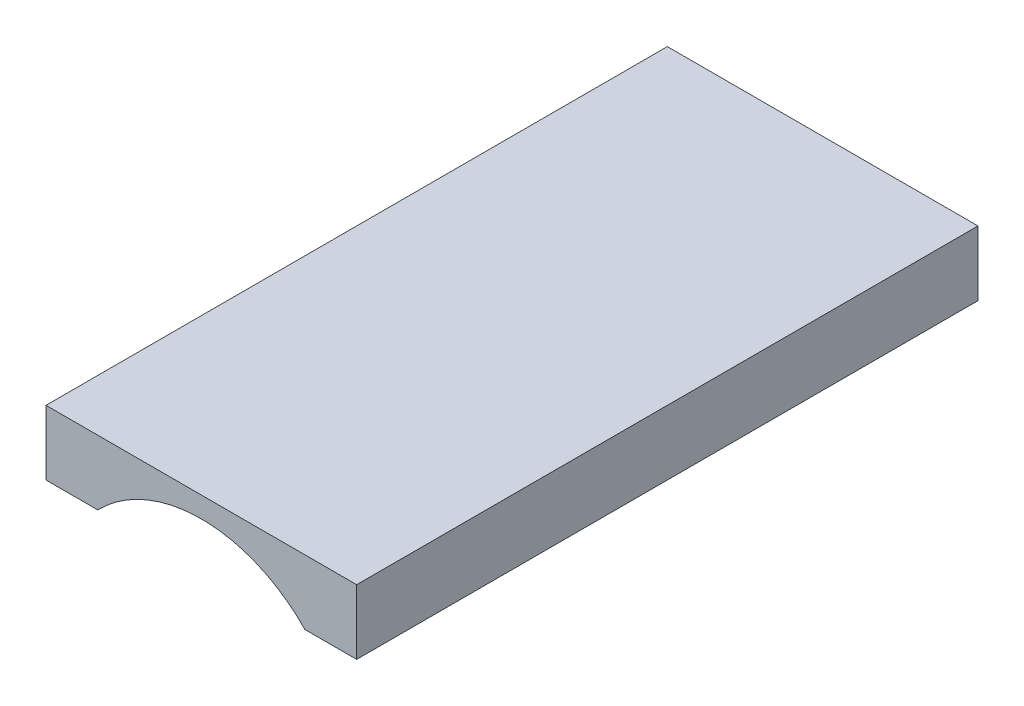
ISO-10303-21;
HEADER;
FILE_DESCRIPTION(('STEP AP214'),'2;1');
FILE_NAME('part.step','',(''),(''),'','','');
FILE_SCHEMA(('AUTOMOTIVE_DESIGN { 1 0 10303 214 1 1 1 1 }'));
ENDSEC;
DATA;
#1=APPLICATION_CONTEXT('core data for automotive mechanical design processes');
#2=APPLICATION_PROTOCOL_DEFINITION('international standard','automotive_design',2000,#1);
#3=PRODUCT_CONTEXT('',#1,'mechanical');
#4=PRODUCT('Part','Part','',(#3));
#5=PRODUCT_RELATED_PRODUCT_CATEGORY('part','',(#4));
#6=PRODUCT_DEFINITION_FORMATION('','',#4);
#7=PRODUCT_DEFINITION_CONTEXT('part definition',#1,'design');
#8=PRODUCT_DEFINITION('design','',#6,#7);
#9=PRODUCT_DEFINITION_SHAPE('','',#8);
#10=(LENGTH_UNIT() NAMED_UNIT(*) SI_UNIT(.MILLI.,.METRE.));
#11=(NAMED_UNIT(*) PLANE_ANGLE_UNIT() SI_UNIT($,.RADIAN.));
#12=(NAMED_UNIT(*) SI_UNIT($,.STERADIAN.) SOLID_ANGLE_UNIT());
#13=UNCERTAINTY_MEASURE_WITH_UNIT(LENGTH_MEASURE(1.E-05),#10,'distance_accuracy_value','');
#14=(GEOMETRIC_REPRESENTATION_CONTEXT(3) GLOBAL_UNCERTAINTY_ASSIGNED_CONTEXT((#13)) GLOBAL_UNIT_ASSIGNED_CONTEXT((#10,
#11,#12)) REPRESENTATION_CONTEXT('',''));
#15=CARTESIAN_POINT('',(0.,0.,0.));
#16=DIRECTION('',(0.,0.,1.));
#17=DIRECTION('',(1.,0.,0.));
#18=AXIS2_PLACEMENT_3D('',#15,#16,#17);
#19=CARTESIAN_POINT('',(30.,0.,-60.));
#20=DIRECTION('',(0.,1.,0.));
#21=DIRECTION('',(0.,0.,1.));
#22=AXIS2_PLACEMENT_3D('',#19,#20,#21);
#23=PLANE('',#22);
#24=DIRECTION('',(1.,0.,0.));
#25=VECTOR('',#24,1.);
#26=CARTESIAN_POINT('',(5.,0.,-45.));
#27=LINE('',#26,#25);
#28=CARTESIAN_POINT('',(5.,0.,-45.));
#29=VERTEX_POINT('',#28);
#30=CARTESIAN_POINT('',(25.,0.,-45.));
#31=VERTEX_POINT('',#30);
#32=EDGE_CURVE('E162',#29,#31,#27,.T.);
#33=ORIENTED_EDGE('',*,*,#32,.F.);
#34=DIRECTION('',(0.,0.,1.));
#35=VECTOR('',#34,1.);
#36=CARTESIAN_POINT('',(5.,0.,-45.));
#37=LINE('',#36,#35);
#38=CARTESIAN_POINT('',(5.,0.,0.));
#39=VERTEX_POINT('',#38);
#40=EDGE_CURVE('E165',#29,#39,#37,.T.);
#41=ORIENTED_EDGE('',*,*,#40,.T.);
#42=DIRECTION('',(-1.,0.,0.));
#43=VECTOR('',#42,1.);
#44=CARTESIAN_POINT('',(30.,0.,0.));
#45=LINE('',#44,#43);
#46=CARTESIAN_POINT('',(0.,0.,0.));
#47=VERTEX_POINT('',#46);
#48=EDGE_CURVE('E180',#39,#47,#45,.T.);
#49=ORIENTED_EDGE('',*,*,#48,.T.);
#50=DIRECTION('',(0.,0.,-1.));
#51=VECTOR('',#50,1.);
#52=CARTESIAN_POINT('',(0.,0.,-60.));
#53=LINE('',#52,#51);
#54=CARTESIAN_POINT('',(0.,0.,-60.));
#55=VERTEX_POINT('',#54);
#56=EDGE_CURVE('E169',#47,#55,#53,.T.);
#57=ORIENTED_EDGE('',*,*,#56,.T.);
#58=DIRECTION('',(-1.,0.,0.));
#59=VECTOR('',#58,1.);
#60=CARTESIAN_POINT('',(30.,0.,-60.));
#61=LINE('',#60,#59);
#62=CARTESIAN_POINT('',(30.,0.,-60.));
#63=VERTEX_POINT('',#62);
#64=EDGE_CURVE('E39',#63,#55,#61,.T.);
#65=ORIENTED_EDGE('',*,*,#64,.F.);
#66=DIRECTION('',(0.,0.,-1.));
#67=VECTOR('',#66,1.);
#68=CARTESIAN_POINT('',(30.,0.,-60.));
#69=LINE('',#68,#67);
#70=CARTESIAN_POINT('',(30.,0.,0.));
#71=VERTEX_POINT('',#70);
#72=EDGE_CURVE('E170',#71,#63,#69,.T.);
#73=ORIENTED_EDGE('',*,*,#72,.F.);
#74=CARTESIAN_POINT('',(25.,0.,0.));
#75=VERTEX_POINT('',#74);
#76=EDGE_CURVE('E190',#71,#75,#45,.T.);
#77=ORIENTED_EDGE('',*,*,#76,.T.);
#78=DIRECTION('',(0.,0.,1.));
#79=VECTOR('',#78,1.);
#80=CARTESIAN_POINT('',(25.,0.,-45.));
#81=LINE('',#80,#79);
#82=EDGE_CURVE('E54',#31,#75,#81,.T.);
#83=ORIENTED_EDGE('',*,*,#82,.F.);
#84=EDGE_LOOP('',(#33,#41,#49,#57,#65,#73,#77,#83));
#85=FACE_BOUND('',#84,.T.);
#86=ADVANCED_FACE('F32',(#85),#23,.F.);
#87=CARTESIAN_POINT('',(30.,6.25,-60.));
#88=DIRECTION('',(0.,0.,1.));
#89=DIRECTION('',(1.,0.,0.));
#90=AXIS2_PLACEMENT_3D('',#87,#88,#89);
#91=PLANE('',#90);
#92=DIRECTION('',(0.,1.,0.));
#93=VECTOR('',#92,1.);
#94=CARTESIAN_POINT('',(10.,2.,-60.));
#95=LINE('',#94,#93);
#96=CARTESIAN_POINT('',(10.,1.99999999999999,-60.));
#97=VERTEX_POINT('',#96);
#98=CARTESIAN_POINT('',(10.,5.,-60.));
#99=VERTEX_POINT('',#98);
#100=EDGE_CURVE('E145',#97,#99,#95,.T.);
#101=ORIENTED_EDGE('',*,*,#100,.F.);
#102=DIRECTION('',(-1.,0.,0.));
#103=VECTOR('',#102,1.);
#104=CARTESIAN_POINT('',(20.,2.,-60.));
#105=LINE('',#104,#103);
#106=CARTESIAN_POINT('',(20.,2.,-60.));
#107=VERTEX_POINT('',#106);
#108=EDGE_CURVE('E46',#107,#97,#105,.T.);
#109=ORIENTED_EDGE('',*,*,#108,.F.);
#110=DIRECTION('',(0.707106781186547,-0.707106781186548,0.));
#111=VECTOR('',#110,1.);
#112=CARTESIAN_POINT('',(20.,2.,-60.));
#113=LINE('',#112,#111);
#114=CARTESIAN_POINT('',(18.5,3.5,-60.));
#115=VERTEX_POINT('',#114);
#116=EDGE_CURVE('E134',#115,#107,#113,.T.);
#117=ORIENTED_EDGE('',*,*,#116,.F.);
#118=DIRECTION('',(-0.707106781186548,-0.707106781186547,0.));
#119=VECTOR('',#118,1.);
#120=CARTESIAN_POINT('',(18.5,3.5,-60.));
#121=LINE('',#120,#119);
#122=CARTESIAN_POINT('',(20.,5.,-60.));
#123=VERTEX_POINT('',#122);
#124=EDGE_CURVE('E137',#123,#115,#121,.T.);
#125=ORIENTED_EDGE('',*,*,#124,.F.);
#126=DIRECTION('',(1.,0.,0.));
#127=VECTOR('',#126,1.);
#128=CARTESIAN_POINT('',(10.,5.,-60.));
#129=LINE('',#128,#127);
#130=EDGE_CURVE('E147',#99,#123,#129,.T.);
#131=ORIENTED_EDGE('',*,*,#130,.F.);
#132=EDGE_LOOP('',(#101,#109,#117,#125,#131));
#133=FACE_BOUND('',#132,.T.);
#134=DIRECTION('',(0.,1.,0.));
#135=VECTOR('',#134,1.);
#136=CARTESIAN_POINT('',(0.,6.25,-60.));
#137=LINE('',#136,#135);
#138=CARTESIAN_POINT('',(0.,6.25,-60.));
#139=VERTEX_POINT('',#138);
#140=EDGE_CURVE('E183',#55,#139,#137,.T.);
#141=ORIENTED_EDGE('',*,*,#140,.T.);
#142=DIRECTION('',(-1.,0.,0.));
#143=VECTOR('',#142,1.);
#144=CARTESIAN_POINT('',(30.,6.25,-60.));
#145=LINE('',#144,#143);
#146=CARTESIAN_POINT('',(30.,6.25,-60.));
#147=VERTEX_POINT('',#146);
#148=EDGE_CURVE('E194',#147,#139,#145,.T.);
#149=ORIENTED_EDGE('',*,*,#148,.F.);
#150=DIRECTION('',(0.,1.,0.));
#151=VECTOR('',#150,1.);
#152=CARTESIAN_POINT('',(30.,6.25,-60.));
#153=LINE('',#152,#151);
#154=EDGE_CURVE('E173',#63,#147,#153,.T.);
#155=ORIENTED_EDGE('',*,*,#154,.F.);
#156=ORIENTED_EDGE('',*,*,#64,.T.);
#157=EDGE_LOOP('',(#141,#149,#155,#156));
#158=FACE_BOUND('',#157,.T.);
#159=ADVANCED_FACE('F199',(#133,#158),#91,.F.);
#160=CARTESIAN_POINT('',(30.,6.25,0.));
#161=DIRECTION('',(0.,-1.,0.));
#162=DIRECTION('',(0.,0.,-1.));
#163=AXIS2_PLACEMENT_3D('',#160,#161,#162);
#164=PLANE('',#163);
#165=DIRECTION('',(0.,0.,1.));
#166=VECTOR('',#165,1.);
#167=CARTESIAN_POINT('',(0.,6.25,0.));
#168=LINE('',#167,#166);
#169=CARTESIAN_POINT('',(0.,6.25,0.));
#170=VERTEX_POINT('',#169);
#171=EDGE_CURVE('E185',#139,#170,#168,.T.);
#172=ORIENTED_EDGE('',*,*,#171,.T.);
#173=DIRECTION('',(-1.,0.,0.));
#174=VECTOR('',#173,1.);
#175=CARTESIAN_POINT('',(30.,6.25,0.));
#176=LINE('',#175,#174);
#177=CARTESIAN_POINT('',(30.,6.25,0.));
#178=VERTEX_POINT('',#177);
#179=EDGE_CURVE('E191',#178,#170,#176,.T.);
#180=ORIENTED_EDGE('',*,*,#179,.F.);
#181=DIRECTION('',(0.,0.,1.));
#182=VECTOR('',#181,1.);
#183=CARTESIAN_POINT('',(30.,6.25,0.));
#184=LINE('',#183,#182);
#185=EDGE_CURVE('E176',#147,#178,#184,.T.);
#186=ORIENTED_EDGE('',*,*,#185,.F.);
#187=ORIENTED_EDGE('',*,*,#148,.T.);
#188=EDGE_LOOP('',(#172,#180,#186,#187));
#189=FACE_BOUND('',#188,.T.);
#190=ADVANCED_FACE('F212',(#189),#164,.F.);
#191=CARTESIAN_POINT('',(30.,0.,0.));
#192=DIRECTION('',(0.,0.,-1.));
#193=DIRECTION('',(-1.,0.,0.));
#194=AXIS2_PLACEMENT_3D('',#191,#192,#193);
#195=PLANE('',#194);
#196=ORIENTED_EDGE('',*,*,#48,.F.);
#197=CARTESIAN_POINT('',(15.,-9.63970588235294,0.));
#198=DIRECTION('',(0.,0.,1.));
#199=DIRECTION('',(1.,0.,0.));
#200=AXIS2_PLACEMENT_3D('',#197,#198,#199);
#201=CIRCLE('',#200,13.8897058823529);
#202=EDGE_CURVE('E11',#39,#75,#201,.F.);
#203=ORIENTED_EDGE('',*,*,#202,.T.);
#204=ORIENTED_EDGE('',*,*,#76,.F.);
#205=DIRECTION('',(0.,-1.,0.));
#206=VECTOR('',#205,1.);
#207=CARTESIAN_POINT('',(30.,0.,0.));
#208=LINE('',#207,#206);
#209=EDGE_CURVE('E178',#178,#71,#208,.T.);
#210=ORIENTED_EDGE('',*,*,#209,.F.);
#211=ORIENTED_EDGE('',*,*,#179,.T.);
#212=DIRECTION('',(0.,-1.,0.));
#213=VECTOR('',#212,1.);
#214=CARTESIAN_POINT('',(0.,0.,0.));
#215=LINE('',#214,#213);
#216=EDGE_CURVE('E174',#170,#47,#215,.T.);
#217=ORIENTED_EDGE('',*,*,#216,.T.);
#218=EDGE_LOOP('',(#196,#203,#204,#210,#211,#217));
#219=FACE_BOUND('',#218,.T.);
#220=ADVANCED_FACE('F216',(#219),#195,.F.);
#221=CARTESIAN_POINT('',(30.,0.,0.));
#222=DIRECTION('',(-1.,0.,0.));
#223=DIRECTION('',(0.,0.,1.));
#224=AXIS2_PLACEMENT_3D('',#221,#222,#223);
#225=PLANE('',#224);
#226=ORIENTED_EDGE('',*,*,#72,.T.);
#227=ORIENTED_EDGE('',*,*,#154,.T.);
#228=ORIENTED_EDGE('',*,*,#185,.T.);
#229=ORIENTED_EDGE('',*,*,#209,.T.);
#230=EDGE_LOOP('',(#226,#227,#228,#229));
#231=FACE_BOUND('',#230,.T.);
#232=ADVANCED_FACE('F220',(#231),#225,.F.);
#233=CARTESIAN_POINT('',(0.,0.,0.));
#234=DIRECTION('',(-1.,0.,0.));
#235=DIRECTION('',(0.,0.,1.));
#236=AXIS2_PLACEMENT_3D('',#233,#234,#235);
#237=PLANE('',#236);
#238=ORIENTED_EDGE('',*,*,#56,.F.);
#239=ORIENTED_EDGE('',*,*,#216,.F.);
#240=ORIENTED_EDGE('',*,*,#171,.F.);
#241=ORIENTED_EDGE('',*,*,#140,.F.);
#242=EDGE_LOOP('',(#238,#239,#240,#241));
#243=FACE_BOUND('',#242,.T.);
#244=ADVANCED_FACE('F208',(#243),#237,.T.);
#245=CARTESIAN_POINT('',(15.,-9.63970588235294,-45.));
#246=DIRECTION('',(0.,0.,1.));
#247=DIRECTION('',(1.,0.,0.));
#248=AXIS2_PLACEMENT_3D('',#245,#246,#247);
#249=CYLINDRICAL_SURFACE('',#248,13.8897058823529);
#250=ORIENTED_EDGE('',*,*,#40,.F.);
#251=CARTESIAN_POINT('',(15.,-9.63970588235294,-45.));
#252=DIRECTION('',(0.,0.,1.));
#253=DIRECTION('',(-1.,0.,0.));
#254=AXIS2_PLACEMENT_3D('',#251,#252,#253);
#255=CIRCLE('',#254,13.8897058823529);
#256=EDGE_CURVE('E154',#31,#29,#255,.T.);
#257=ORIENTED_EDGE('',*,*,#256,.F.);
#258=ORIENTED_EDGE('',*,*,#82,.T.);
#259=ORIENTED_EDGE('',*,*,#202,.F.);
#260=EDGE_LOOP('',(#250,#257,#258,#259));
#261=FACE_BOUND('',#260,.T.);
#262=ADVANCED_FACE('F223',(#261),#249,.F.);
#263=CARTESIAN_POINT('',(15.,-9.63970588235294,-45.));
#264=DIRECTION('',(0.,0.,-1.));
#265=DIRECTION('',(-1.,0.,0.));
#266=AXIS2_PLACEMENT_3D('',#263,#264,#265);
#267=PLANE('',#266);
#268=ORIENTED_EDGE('',*,*,#256,.T.);
#269=ORIENTED_EDGE('',*,*,#32,.T.);
#270=EDGE_LOOP('',(#268,#269));
#271=FACE_BOUND('',#270,.T.);
#272=ADVANCED_FACE('F222',(#271),#267,.F.);
#273=CARTESIAN_POINT('',(20.,2.,-47.));
#274=DIRECTION('',(0.,-1.,0.));
#275=DIRECTION('',(1.,0.,0.));
#276=AXIS2_PLACEMENT_3D('',#273,#274,#275);
#277=PLANE('',#276);
#278=ORIENTED_EDGE('',*,*,#108,.T.);
#279=DIRECTION('',(0.,0.,-1.));
#280=VECTOR('',#279,1.);
#281=CARTESIAN_POINT('',(10.,2.,-47.));
#282=LINE('',#281,#280);
#283=CARTESIAN_POINT('',(10.,2.,-47.));
#284=VERTEX_POINT('',#283);
#285=EDGE_CURVE('E111',#284,#97,#282,.T.);
#286=ORIENTED_EDGE('',*,*,#285,.F.);
#287=DIRECTION('',(-1.,0.,0.));
#288=VECTOR('',#287,1.);
#289=CARTESIAN_POINT('',(20.,2.,-47.));
#290=LINE('',#289,#288);
#291=CARTESIAN_POINT('',(20.,2.,-47.));
#292=VERTEX_POINT('',#291);
#293=EDGE_CURVE('E115',#292,#284,#290,.T.);
#294=ORIENTED_EDGE('',*,*,#293,.F.);
#295=DIRECTION('',(0.,0.,-1.));
#296=VECTOR('',#295,1.);
#297=CARTESIAN_POINT('',(20.,2.,-47.));
#298=LINE('',#297,#296);
#299=EDGE_CURVE('E152',#292,#107,#298,.T.);
#300=ORIENTED_EDGE('',*,*,#299,.T.);
#301=EDGE_LOOP('',(#278,#286,#294,#300));
#302=FACE_BOUND('',#301,.T.);
#303=ADVANCED_FACE('F113',(#302),#277,.F.);
#304=CARTESIAN_POINT('',(20.,2.,-47.));
#305=DIRECTION('',(0.707106781186548,0.707106781186547,0.));
#306=DIRECTION('',(-0.707106781186547,0.707106781186548,0.));
#307=AXIS2_PLACEMENT_3D('',#304,#305,#306);
#308=PLANE('',#307);
#309=ORIENTED_EDGE('',*,*,#116,.T.);
#310=ORIENTED_EDGE('',*,*,#299,.F.);
#311=DIRECTION('',(0.707106781186547,-0.707106781186548,0.));
#312=VECTOR('',#311,1.);
#313=CARTESIAN_POINT('',(20.,2.,-47.));
#314=LINE('',#313,#312);
#315=CARTESIAN_POINT('',(18.5,3.5,-47.));
#316=VERTEX_POINT('',#315);
#317=EDGE_CURVE('E121',#316,#292,#314,.T.);
#318=ORIENTED_EDGE('',*,*,#317,.F.);
#319=DIRECTION('',(0.,0.,-1.));
#320=VECTOR('',#319,1.);
#321=CARTESIAN_POINT('',(18.5,3.5,-47.));
#322=LINE('',#321,#320);
#323=EDGE_CURVE('E155',#316,#115,#322,.T.);
#324=ORIENTED_EDGE('',*,*,#323,.T.);
#325=EDGE_LOOP('',(#309,#310,#318,#324));
#326=FACE_BOUND('',#325,.T.);
#327=ADVANCED_FACE('F283',(#326),#308,.F.);
#328=CARTESIAN_POINT('',(18.5,3.5,-47.));
#329=DIRECTION('',(0.707106781186547,-0.707106781186548,0.));
#330=DIRECTION('',(0.707106781186548,0.707106781186547,0.));
#331=AXIS2_PLACEMENT_3D('',#328,#329,#330);
#332=PLANE('',#331);
#333=ORIENTED_EDGE('',*,*,#124,.T.);
#334=ORIENTED_EDGE('',*,*,#323,.F.);
#335=DIRECTION('',(-0.707106781186548,-0.707106781186547,0.));
#336=VECTOR('',#335,1.);
#337=CARTESIAN_POINT('',(18.5,3.5,-47.));
#338=LINE('',#337,#336);
#339=CARTESIAN_POINT('',(20.,5.,-47.));
#340=VERTEX_POINT('',#339);
#341=EDGE_CURVE('E141',#340,#316,#338,.T.);
#342=ORIENTED_EDGE('',*,*,#341,.F.);
#343=DIRECTION('',(0.,0.,-1.));
#344=VECTOR('',#343,1.);
#345=CARTESIAN_POINT('',(20.,5.,-47.));
#346=LINE('',#345,#344);
#347=EDGE_CURVE('E157',#340,#123,#346,.T.);
#348=ORIENTED_EDGE('',*,*,#347,.T.);
#349=EDGE_LOOP('',(#333,#334,#342,#348));
#350=FACE_BOUND('',#349,.T.);
#351=ADVANCED_FACE('F289',(#350),#332,.F.);
#352=CARTESIAN_POINT('',(10.,5.,-47.));
#353=DIRECTION('',(0.,1.,0.));
#354=DIRECTION('',(0.,0.,1.));
#355=AXIS2_PLACEMENT_3D('',#352,#353,#354);
#356=PLANE('',#355);
#357=ORIENTED_EDGE('',*,*,#130,.T.);
#358=ORIENTED_EDGE('',*,*,#347,.F.);
#359=DIRECTION('',(1.,0.,0.));
#360=VECTOR('',#359,1.);
#361=CARTESIAN_POINT('',(10.,5.,-47.));
#362=LINE('',#361,#360);
#363=CARTESIAN_POINT('',(10.,5.,-47.));
#364=VERTEX_POINT('',#363);
#365=EDGE_CURVE('E129',#364,#340,#362,.T.);
#366=ORIENTED_EDGE('',*,*,#365,.F.);
#367=DIRECTION('',(0.,0.,-1.));
#368=VECTOR('',#367,1.);
#369=CARTESIAN_POINT('',(10.,5.,-47.));
#370=LINE('',#369,#368);
#371=EDGE_CURVE('E120',#364,#99,#370,.T.);
#372=ORIENTED_EDGE('',*,*,#371,.T.);
#373=EDGE_LOOP('',(#357,#358,#366,#372));
#374=FACE_BOUND('',#373,.T.);
#375=ADVANCED_FACE('F297',(#374),#356,.F.);
#376=CARTESIAN_POINT('',(10.,2.,-47.));
#377=DIRECTION('',(-1.,0.,0.));
#378=DIRECTION('',(0.,0.,1.));
#379=AXIS2_PLACEMENT_3D('',#376,#377,#378);
#380=PLANE('',#379);
#381=ORIENTED_EDGE('',*,*,#100,.T.);
#382=ORIENTED_EDGE('',*,*,#371,.F.);
#383=DIRECTION('',(0.,1.,0.));
#384=VECTOR('',#383,1.);
#385=CARTESIAN_POINT('',(10.,2.,-47.));
#386=LINE('',#385,#384);
#387=EDGE_CURVE('E124',#284,#364,#386,.T.);
#388=ORIENTED_EDGE('',*,*,#387,.F.);
#389=ORIENTED_EDGE('',*,*,#285,.T.);
#390=EDGE_LOOP('',(#381,#382,#388,#389));
#391=FACE_BOUND('',#390,.T.);
#392=ADVANCED_FACE('F125',(#391),#380,.F.);
#393=CARTESIAN_POINT('',(0.,0.,-47.));
#394=DIRECTION('',(0.,0.,-1.));
#395=DIRECTION('',(-1.,0.,0.));
#396=AXIS2_PLACEMENT_3D('',#393,#394,#395);
#397=PLANE('',#396);
#398=ORIENTED_EDGE('',*,*,#293,.T.);
#399=ORIENTED_EDGE('',*,*,#387,.T.);
#400=ORIENTED_EDGE('',*,*,#365,.T.);
#401=ORIENTED_EDGE('',*,*,#341,.T.);
#402=ORIENTED_EDGE('',*,*,#317,.T.);
#403=EDGE_LOOP('',(#398,#399,#400,#401,#402));
#404=FACE_BOUND('',#403,.T.);
#405=ADVANCED_FACE('F131',(#404),#397,.T.);
#406=CLOSED_SHELL('',(#86,#159,#190,#220,#232,#244,#262,#272,#303,#327,#351,#375,#392,#405));
#407=MANIFOLD_SOLID_BREP('B2',#406);
#408=ADVANCED_BREP_SHAPE_REPRESENTATION('',(#18,#407),#14);
#409=SHAPE_DEFINITION_REPRESENTATION(#9,#408);
ENDSEC;
END-ISO-10303-21;
